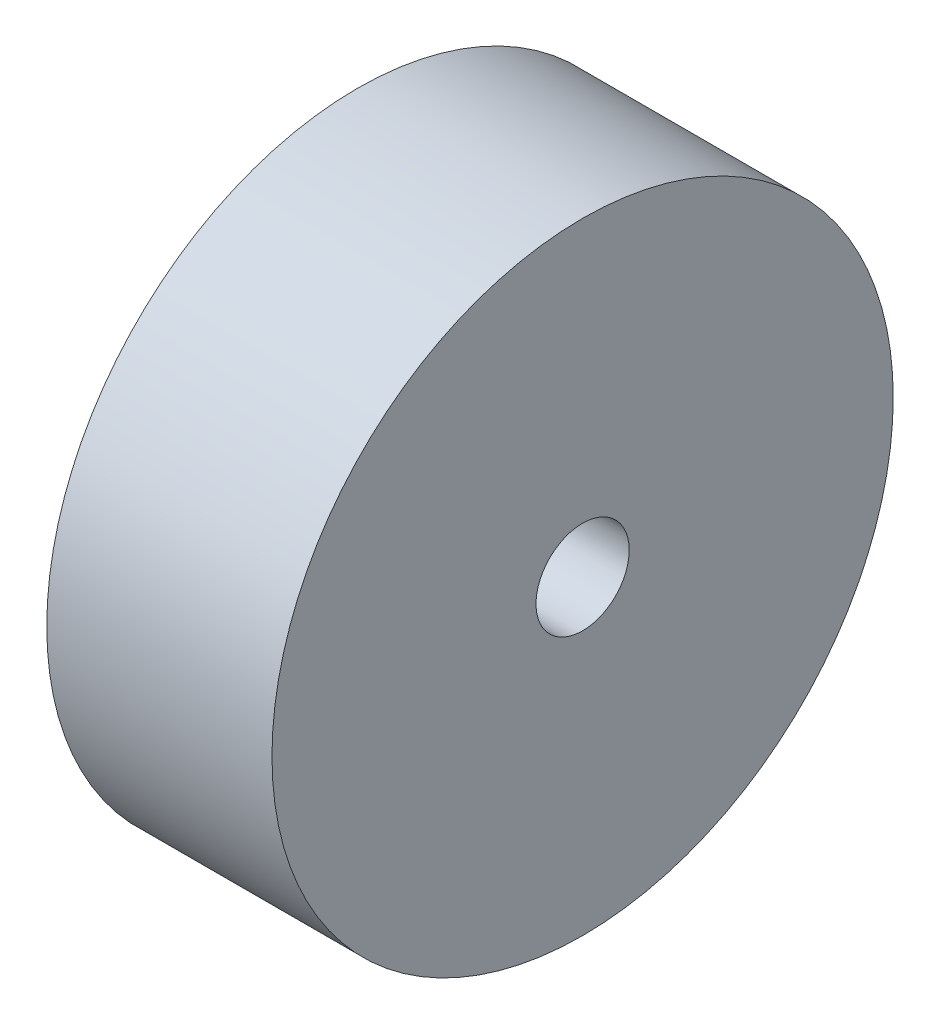
ISO-10303-21;
HEADER;
FILE_DESCRIPTION(('STEP AP214'),'2;1');
FILE_NAME('part.step','',(''),(''),'','','');
FILE_SCHEMA(('AUTOMOTIVE_DESIGN { 1 0 10303 214 1 1 1 1 }'));
ENDSEC;
DATA;
#1=APPLICATION_CONTEXT('core data for automotive mechanical design processes');
#2=APPLICATION_PROTOCOL_DEFINITION('international standard','automotive_design',2000,#1);
#3=PRODUCT_CONTEXT('',#1,'mechanical');
#4=PRODUCT('Part','Part','',(#3));
#5=PRODUCT_RELATED_PRODUCT_CATEGORY('part','',(#4));
#6=PRODUCT_DEFINITION_FORMATION('','',#4);
#7=PRODUCT_DEFINITION_CONTEXT('part definition',#1,'design');
#8=PRODUCT_DEFINITION('design','',#6,#7);
#9=PRODUCT_DEFINITION_SHAPE('','',#8);
#10=(LENGTH_UNIT() NAMED_UNIT(*) SI_UNIT(.MILLI.,.METRE.));
#11=(NAMED_UNIT(*) PLANE_ANGLE_UNIT() SI_UNIT($,.RADIAN.));
#12=(NAMED_UNIT(*) SI_UNIT($,.STERADIAN.) SOLID_ANGLE_UNIT());
#13=UNCERTAINTY_MEASURE_WITH_UNIT(LENGTH_MEASURE(1.E-05),#10,'distance_accuracy_value','');
#14=(GEOMETRIC_REPRESENTATION_CONTEXT(3) GLOBAL_UNCERTAINTY_ASSIGNED_CONTEXT((#13)) GLOBAL_UNIT_ASSIGNED_CONTEXT((#10,
#11,#12)) REPRESENTATION_CONTEXT('',''));
#15=CARTESIAN_POINT('',(0.,0.,0.));
#16=DIRECTION('',(0.,0.,1.));
#17=DIRECTION('',(1.,0.,0.));
#18=AXIS2_PLACEMENT_3D('',#15,#16,#17);
#19=CARTESIAN_POINT('',(-3.001,0.,0.));
#20=DIRECTION('',(1.,0.,0.));
#21=DIRECTION('',(0.,0.,-1.));
#22=AXIS2_PLACEMENT_3D('',#19,#20,#21);
#23=CYLINDRICAL_SURFACE('',#22,1.5);
#24=CARTESIAN_POINT('',(4.25,0.,0.));
#25=DIRECTION('',(1.,0.,0.));
#26=DIRECTION('',(0.,0.,-1.));
#27=AXIS2_PLACEMENT_3D('',#24,#25,#26);
#28=CIRCLE('',#27,1.5);
#29=CARTESIAN_POINT('',(4.25,0.,-1.5));
#30=VERTEX_POINT('',#29);
#31=EDGE_CURVE('E53',#30,#30,#28,.T.);
#32=ORIENTED_EDGE('',*,*,#31,.T.);
#33=EDGE_LOOP('',(#32));
#34=FACE_BOUND('',#33,.T.);
#35=CARTESIAN_POINT('',(-0.5,0.,0.));
#36=DIRECTION('',(-1.,0.,0.));
#37=DIRECTION('',(0.,0.,1.));
#38=AXIS2_PLACEMENT_3D('',#35,#36,#37);
#39=CIRCLE('',#38,1.5);
#40=CARTESIAN_POINT('',(-0.5,0.,1.5));
#41=VERTEX_POINT('',#40);
#42=EDGE_CURVE('E45',#41,#41,#39,.F.);
#43=ORIENTED_EDGE('',*,*,#42,.F.);
#44=EDGE_LOOP('',(#43));
#45=FACE_BOUND('',#44,.T.);
#46=ADVANCED_FACE('F41',(#34,#45),#23,.F.);
#47=CARTESIAN_POINT('',(4.25,0.,0.));
#48=DIRECTION('',(-1.,0.,0.));
#49=DIRECTION('',(0.,0.,1.));
#50=AXIS2_PLACEMENT_3D('',#47,#48,#49);
#51=CYLINDRICAL_SURFACE('',#50,10.);
#52=CARTESIAN_POINT('',(4.25,0.,0.));
#53=DIRECTION('',(1.,0.,0.));
#54=DIRECTION('',(0.,0.,-1.));
#55=AXIS2_PLACEMENT_3D('',#52,#53,#54);
#56=CIRCLE('',#55,10.);
#57=CARTESIAN_POINT('',(4.25,0.,-10.));
#58=VERTEX_POINT('',#57);
#59=EDGE_CURVE('E10',#58,#58,#56,.T.);
#60=ORIENTED_EDGE('',*,*,#59,.F.);
#61=EDGE_LOOP('',(#60));
#62=FACE_BOUND('',#61,.T.);
#63=CARTESIAN_POINT('',(-3.,0.,0.));
#64=DIRECTION('',(-1.,0.,0.));
#65=DIRECTION('',(0.,0.,1.));
#66=AXIS2_PLACEMENT_3D('',#63,#64,#65);
#67=CIRCLE('',#66,10.);
#68=CARTESIAN_POINT('',(-3.,0.,10.));
#69=VERTEX_POINT('',#68);
#70=EDGE_CURVE('E49',#69,#69,#67,.T.);
#71=ORIENTED_EDGE('',*,*,#70,.F.);
#72=EDGE_LOOP('',(#71));
#73=FACE_BOUND('',#72,.T.);
#74=ADVANCED_FACE('F43',(#62,#73),#51,.T.);
#75=CARTESIAN_POINT('',(4.25,0.,0.));
#76=DIRECTION('',(1.,0.,0.));
#77=DIRECTION('',(0.,0.,-1.));
#78=AXIS2_PLACEMENT_3D('',#75,#76,#77);
#79=PLANE('',#78);
#80=ORIENTED_EDGE('',*,*,#31,.F.);
#81=EDGE_LOOP('',(#80));
#82=FACE_BOUND('',#81,.T.);
#83=ORIENTED_EDGE('',*,*,#59,.T.);
#84=EDGE_LOOP('',(#83));
#85=FACE_BOUND('',#84,.T.);
#86=ADVANCED_FACE('F78',(#82,#85),#79,.T.);
#87=CARTESIAN_POINT('',(-3.,0.,0.));
#88=DIRECTION('',(-1.,0.,0.));
#89=DIRECTION('',(0.,0.,1.));
#90=AXIS2_PLACEMENT_3D('',#87,#88,#89);
#91=PLANE('',#90);
#92=CARTESIAN_POINT('',(-3.,0.,0.));
#93=DIRECTION('',(-1.,0.,0.));
#94=DIRECTION('',(0.,0.,1.));
#95=AXIS2_PLACEMENT_3D('',#92,#93,#94);
#96=CIRCLE('',#95,6.);
#97=CARTESIAN_POINT('',(-3.,0.,6.));
#98=VERTEX_POINT('',#97);
#99=EDGE_CURVE('E58',#98,#98,#96,.T.);
#100=ORIENTED_EDGE('',*,*,#99,.F.);
#101=EDGE_LOOP('',(#100));
#102=FACE_BOUND('',#101,.T.);
#103=ORIENTED_EDGE('',*,*,#70,.T.);
#104=EDGE_LOOP('',(#103));
#105=FACE_BOUND('',#104,.T.);
#106=ADVANCED_FACE('F84',(#102,#105),#91,.T.);
#107=CARTESIAN_POINT('',(-0.5,0.,0.));
#108=DIRECTION('',(-1.,0.,0.));
#109=DIRECTION('',(0.,0.,1.));
#110=AXIS2_PLACEMENT_3D('',#107,#108,#109);
#111=PLANE('',#110);
#112=CARTESIAN_POINT('',(-0.5,0.,0.));
#113=DIRECTION('',(-1.,0.,0.));
#114=DIRECTION('',(0.,0.,1.));
#115=AXIS2_PLACEMENT_3D('',#112,#113,#114);
#116=CIRCLE('',#115,6.);
#117=CARTESIAN_POINT('',(-0.5,0.,6.));
#118=VERTEX_POINT('',#117);
#119=EDGE_CURVE('E61',#118,#118,#116,.T.);
#120=ORIENTED_EDGE('',*,*,#119,.T.);
#121=EDGE_LOOP('',(#120));
#122=FACE_BOUND('',#121,.T.);
#123=ORIENTED_EDGE('',*,*,#42,.T.);
#124=EDGE_LOOP('',(#123));
#125=FACE_BOUND('',#124,.T.);
#126=ADVANCED_FACE('F68',(#122,#125),#111,.T.);
#127=CARTESIAN_POINT('',(-0.5,0.,0.));
#128=DIRECTION('',(-1.,0.,0.));
#129=DIRECTION('',(0.,0.,1.));
#130=AXIS2_PLACEMENT_3D('',#127,#128,#129);
#131=CYLINDRICAL_SURFACE('',#130,6.);
#132=ORIENTED_EDGE('',*,*,#119,.F.);
#133=EDGE_LOOP('',(#132));
#134=FACE_BOUND('',#133,.T.);
#135=ORIENTED_EDGE('',*,*,#99,.T.);
#136=EDGE_LOOP('',(#135));
#137=FACE_BOUND('',#136,.T.);
#138=ADVANCED_FACE('F82',(#134,#137),#131,.F.);
#139=CLOSED_SHELL('',(#46,#74,#86,#106,#126,#138));
#140=MANIFOLD_SOLID_BREP('B2',#139);
#141=ADVANCED_BREP_SHAPE_REPRESENTATION('',(#18,#140),#14);
#142=SHAPE_DEFINITION_REPRESENTATION(#9,#141);
ENDSEC;
END-ISO-10303-21;
